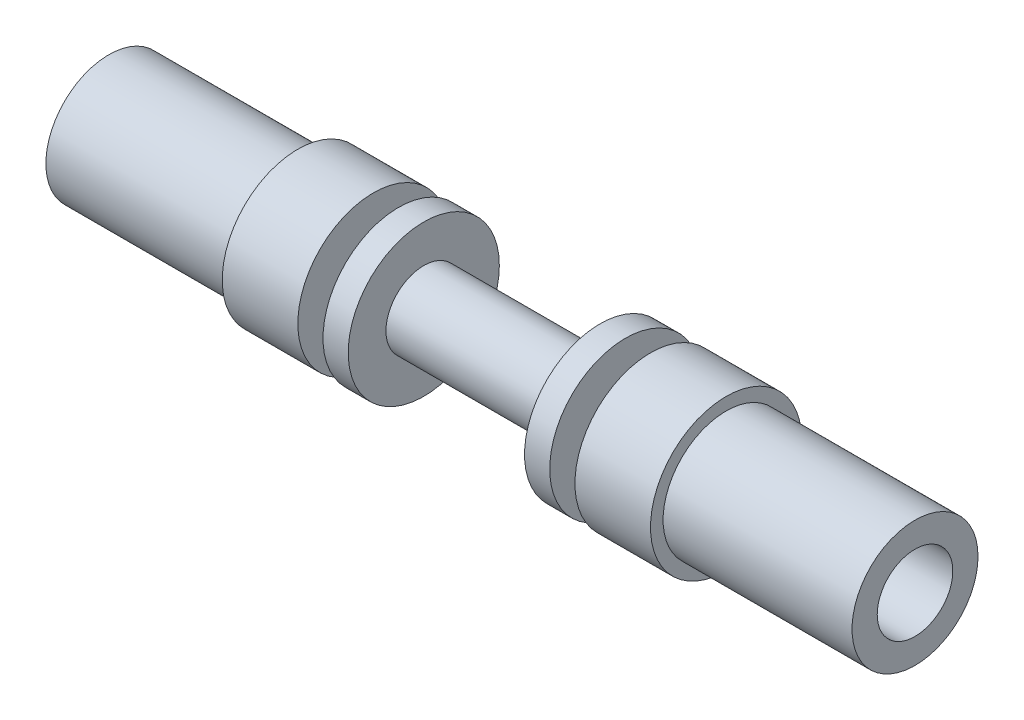
ISO-10303-21;
HEADER;
FILE_DESCRIPTION(('STEP AP214'),'2;1');
FILE_NAME('part.step','',(''),(''),'','','');
FILE_SCHEMA(('AUTOMOTIVE_DESIGN { 1 0 10303 214 1 1 1 1 }'));
ENDSEC;
DATA;
#1=APPLICATION_CONTEXT('core data for automotive mechanical design processes');
#2=APPLICATION_PROTOCOL_DEFINITION('international standard','automotive_design',2000,#1);
#3=PRODUCT_CONTEXT('',#1,'mechanical');
#4=PRODUCT('Part','Part','',(#3));
#5=PRODUCT_RELATED_PRODUCT_CATEGORY('part','',(#4));
#6=PRODUCT_DEFINITION_FORMATION('','',#4);
#7=PRODUCT_DEFINITION_CONTEXT('part definition',#1,'design');
#8=PRODUCT_DEFINITION('design','',#6,#7);
#9=PRODUCT_DEFINITION_SHAPE('','',#8);
#10=(LENGTH_UNIT() NAMED_UNIT(*) SI_UNIT(.MILLI.,.METRE.));
#11=(NAMED_UNIT(*) PLANE_ANGLE_UNIT() SI_UNIT($,.RADIAN.));
#12=(NAMED_UNIT(*) SI_UNIT($,.STERADIAN.) SOLID_ANGLE_UNIT());
#13=UNCERTAINTY_MEASURE_WITH_UNIT(LENGTH_MEASURE(1.E-05),#10,'distance_accuracy_value','');
#14=(GEOMETRIC_REPRESENTATION_CONTEXT(3) GLOBAL_UNCERTAINTY_ASSIGNED_CONTEXT((#13)) GLOBAL_UNIT_ASSIGNED_CONTEXT((#10,
#11,#12)) REPRESENTATION_CONTEXT('',''));
#15=CARTESIAN_POINT('',(0.,0.,0.));
#16=DIRECTION('',(0.,0.,1.));
#17=DIRECTION('',(1.,0.,0.));
#18=AXIS2_PLACEMENT_3D('',#15,#16,#17);
#19=CARTESIAN_POINT('',(-10.,0.,0.));
#20=DIRECTION('',(1.,0.,0.));
#21=DIRECTION('',(0.,0.,-1.));
#22=AXIS2_PLACEMENT_3D('',#19,#20,#21);
#23=PLANE('',#22);
#24=CARTESIAN_POINT('',(-10.,0.,0.));
#25=DIRECTION('',(-1.,0.,0.));
#26=DIRECTION('',(0.,0.,1.));
#27=AXIS2_PLACEMENT_3D('',#24,#25,#26);
#28=CIRCLE('',#27,1.5);
#29=CARTESIAN_POINT('',(-10.,0.,1.5));
#30=VERTEX_POINT('',#29);
#31=EDGE_CURVE('E126',#30,#30,#28,.T.);
#32=ORIENTED_EDGE('',*,*,#31,.T.);
#33=EDGE_LOOP('',(#32));
#34=FACE_BOUND('',#33,.T.);
#35=ADVANCED_FACE('F15',(#34),#23,.F.);
#36=CARTESIAN_POINT('',(-16.,0.,0.));
#37=DIRECTION('',(-1.,0.,0.));
#38=DIRECTION('',(0.,0.,1.));
#39=AXIS2_PLACEMENT_3D('',#36,#37,#38);
#40=CYLINDRICAL_SURFACE('',#39,1.5);
#41=CARTESIAN_POINT('',(-16.,0.,0.));
#42=DIRECTION('',(-1.,0.,0.));
#43=DIRECTION('',(0.,0.,1.));
#44=AXIS2_PLACEMENT_3D('',#41,#42,#43);
#45=CIRCLE('',#44,1.5);
#46=CARTESIAN_POINT('',(-16.,0.,1.5));
#47=VERTEX_POINT('',#46);
#48=EDGE_CURVE('E121',#47,#47,#45,.T.);
#49=ORIENTED_EDGE('',*,*,#48,.T.);
#50=EDGE_LOOP('',(#49));
#51=FACE_BOUND('',#50,.T.);
#52=ORIENTED_EDGE('',*,*,#31,.F.);
#53=EDGE_LOOP('',(#52));
#54=FACE_BOUND('',#53,.T.);
#55=ADVANCED_FACE('F132',(#51,#54),#40,.F.);
#56=CARTESIAN_POINT('',(-16.,0.,0.));
#57=DIRECTION('',(1.,0.,0.));
#58=DIRECTION('',(0.,0.,-1.));
#59=AXIS2_PLACEMENT_3D('',#56,#57,#58);
#60=PLANE('',#59);
#61=ORIENTED_EDGE('',*,*,#48,.F.);
#62=EDGE_LOOP('',(#61));
#63=FACE_BOUND('',#62,.T.);
#64=CARTESIAN_POINT('',(-16.,0.,0.));
#65=DIRECTION('',(1.,0.,0.));
#66=DIRECTION('',(0.,0.,-1.));
#67=AXIS2_PLACEMENT_3D('',#64,#65,#66);
#68=CIRCLE('',#67,2.5);
#69=CARTESIAN_POINT('',(-16.,0.,-2.5));
#70=VERTEX_POINT('',#69);
#71=EDGE_CURVE('E116',#70,#70,#68,.T.);
#72=ORIENTED_EDGE('',*,*,#71,.F.);
#73=EDGE_LOOP('',(#72));
#74=FACE_BOUND('',#73,.T.);
#75=ADVANCED_FACE('F134',(#63,#74),#60,.F.);
#76=CARTESIAN_POINT('',(-16.,0.,0.));
#77=DIRECTION('',(1.,0.,0.));
#78=DIRECTION('',(0.,0.,-1.));
#79=AXIS2_PLACEMENT_3D('',#76,#77,#78);
#80=CYLINDRICAL_SURFACE('',#79,2.5);
#81=ORIENTED_EDGE('',*,*,#71,.T.);
#82=EDGE_LOOP('',(#81));
#83=FACE_BOUND('',#82,.T.);
#84=CARTESIAN_POINT('',(-8.5,0.,0.));
#85=DIRECTION('',(1.,0.,0.));
#86=DIRECTION('',(0.,0.,-1.));
#87=AXIS2_PLACEMENT_3D('',#84,#85,#86);
#88=CIRCLE('',#87,2.5);
#89=CARTESIAN_POINT('',(-8.5,0.,-2.5));
#90=VERTEX_POINT('',#89);
#91=EDGE_CURVE('E111',#90,#90,#88,.F.);
#92=ORIENTED_EDGE('',*,*,#91,.T.);
#93=EDGE_LOOP('',(#92));
#94=FACE_BOUND('',#93,.T.);
#95=ADVANCED_FACE('F141',(#83,#94),#80,.T.);
#96=CARTESIAN_POINT('',(-8.5,0.,0.));
#97=DIRECTION('',(1.,0.,0.));
#98=DIRECTION('',(0.,0.,-1.));
#99=AXIS2_PLACEMENT_3D('',#96,#97,#98);
#100=PLANE('',#99);
#101=ORIENTED_EDGE('',*,*,#91,.F.);
#102=EDGE_LOOP('',(#101));
#103=FACE_BOUND('',#102,.T.);
#104=CARTESIAN_POINT('',(-8.5,0.,0.));
#105=DIRECTION('',(1.,0.,0.));
#106=DIRECTION('',(0.,0.,-1.));
#107=AXIS2_PLACEMENT_3D('',#104,#105,#106);
#108=CIRCLE('',#107,3.);
#109=CARTESIAN_POINT('',(-8.5,0.,-3.));
#110=VERTEX_POINT('',#109);
#111=EDGE_CURVE('E106',#110,#110,#108,.T.);
#112=ORIENTED_EDGE('',*,*,#111,.F.);
#113=EDGE_LOOP('',(#112));
#114=FACE_BOUND('',#113,.T.);
#115=ADVANCED_FACE('F218',(#103,#114),#100,.F.);
#116=CARTESIAN_POINT('',(-8.5,0.,0.));
#117=DIRECTION('',(1.,0.,0.));
#118=DIRECTION('',(0.,0.,-1.));
#119=AXIS2_PLACEMENT_3D('',#116,#117,#118);
#120=CYLINDRICAL_SURFACE('',#119,3.);
#121=ORIENTED_EDGE('',*,*,#111,.T.);
#122=EDGE_LOOP('',(#121));
#123=FACE_BOUND('',#122,.T.);
#124=CARTESIAN_POINT('',(-5.5,0.,0.));
#125=DIRECTION('',(1.,0.,0.));
#126=DIRECTION('',(0.,0.,-1.));
#127=AXIS2_PLACEMENT_3D('',#124,#125,#126);
#128=CIRCLE('',#127,3.);
#129=CARTESIAN_POINT('',(-5.5,0.,-3.));
#130=VERTEX_POINT('',#129);
#131=EDGE_CURVE('E101',#130,#130,#128,.T.);
#132=ORIENTED_EDGE('',*,*,#131,.F.);
#133=EDGE_LOOP('',(#132));
#134=FACE_BOUND('',#133,.T.);
#135=ADVANCED_FACE('F214',(#123,#134),#120,.T.);
#136=CARTESIAN_POINT('',(-5.5,0.,0.));
#137=DIRECTION('',(1.,0.,0.));
#138=DIRECTION('',(0.,0.,-1.));
#139=AXIS2_PLACEMENT_3D('',#136,#137,#138);
#140=PLANE('',#139);
#141=CARTESIAN_POINT('',(-5.5,0.,0.));
#142=DIRECTION('',(-1.,0.,0.));
#143=DIRECTION('',(0.,0.,1.));
#144=AXIS2_PLACEMENT_3D('',#141,#142,#143);
#145=CIRCLE('',#144,1.5);
#146=CARTESIAN_POINT('',(-5.5,0.,1.5));
#147=VERTEX_POINT('',#146);
#148=EDGE_CURVE('E96',#147,#147,#145,.F.);
#149=ORIENTED_EDGE('',*,*,#148,.F.);
#150=EDGE_LOOP('',(#149));
#151=FACE_BOUND('',#150,.T.);
#152=ORIENTED_EDGE('',*,*,#131,.T.);
#153=EDGE_LOOP('',(#152));
#154=FACE_BOUND('',#153,.T.);
#155=ADVANCED_FACE('F210',(#151,#154),#140,.T.);
#156=CARTESIAN_POINT('',(-5.5,0.,0.));
#157=DIRECTION('',(-1.,0.,0.));
#158=DIRECTION('',(0.,0.,1.));
#159=AXIS2_PLACEMENT_3D('',#156,#157,#158);
#160=CYLINDRICAL_SURFACE('',#159,1.5);
#161=ORIENTED_EDGE('',*,*,#148,.T.);
#162=EDGE_LOOP('',(#161));
#163=FACE_BOUND('',#162,.T.);
#164=CARTESIAN_POINT('',(-4.5,0.,0.));
#165=DIRECTION('',(-1.,0.,0.));
#166=DIRECTION('',(0.,0.,1.));
#167=AXIS2_PLACEMENT_3D('',#164,#165,#166);
#168=CIRCLE('',#167,1.5);
#169=CARTESIAN_POINT('',(-4.5,0.,1.5));
#170=VERTEX_POINT('',#169);
#171=EDGE_CURVE('E91',#170,#170,#168,.T.);
#172=ORIENTED_EDGE('',*,*,#171,.T.);
#173=EDGE_LOOP('',(#172));
#174=FACE_BOUND('',#173,.T.);
#175=ADVANCED_FACE('F206',(#163,#174),#160,.T.);
#176=CARTESIAN_POINT('',(-4.5,0.,0.));
#177=DIRECTION('',(1.,0.,0.));
#178=DIRECTION('',(0.,0.,-1.));
#179=AXIS2_PLACEMENT_3D('',#176,#177,#178);
#180=PLANE('',#179);
#181=ORIENTED_EDGE('',*,*,#171,.F.);
#182=EDGE_LOOP('',(#181));
#183=FACE_BOUND('',#182,.T.);
#184=CARTESIAN_POINT('',(-4.5,0.,0.));
#185=DIRECTION('',(1.,0.,0.));
#186=DIRECTION('',(0.,0.,-1.));
#187=AXIS2_PLACEMENT_3D('',#184,#185,#186);
#188=CIRCLE('',#187,3.);
#189=CARTESIAN_POINT('',(-4.5,0.,-3.));
#190=VERTEX_POINT('',#189);
#191=EDGE_CURVE('E86',#190,#190,#188,.T.);
#192=ORIENTED_EDGE('',*,*,#191,.F.);
#193=EDGE_LOOP('',(#192));
#194=FACE_BOUND('',#193,.T.);
#195=ADVANCED_FACE('F202',(#183,#194),#180,.F.);
#196=CARTESIAN_POINT('',(-4.5,0.,0.));
#197=DIRECTION('',(1.,0.,0.));
#198=DIRECTION('',(0.,0.,-1.));
#199=AXIS2_PLACEMENT_3D('',#196,#197,#198);
#200=CYLINDRICAL_SURFACE('',#199,3.);
#201=ORIENTED_EDGE('',*,*,#191,.T.);
#202=EDGE_LOOP('',(#201));
#203=FACE_BOUND('',#202,.T.);
#204=CARTESIAN_POINT('',(-3.5,0.,0.));
#205=DIRECTION('',(1.,0.,0.));
#206=DIRECTION('',(0.,0.,-1.));
#207=AXIS2_PLACEMENT_3D('',#204,#205,#206);
#208=CIRCLE('',#207,3.);
#209=CARTESIAN_POINT('',(-3.5,0.,-3.));
#210=VERTEX_POINT('',#209);
#211=EDGE_CURVE('E81',#210,#210,#208,.T.);
#212=ORIENTED_EDGE('',*,*,#211,.F.);
#213=EDGE_LOOP('',(#212));
#214=FACE_BOUND('',#213,.T.);
#215=ADVANCED_FACE('F198',(#203,#214),#200,.T.);
#216=CARTESIAN_POINT('',(-3.5,0.,0.));
#217=DIRECTION('',(1.,0.,0.));
#218=DIRECTION('',(0.,0.,-1.));
#219=AXIS2_PLACEMENT_3D('',#216,#217,#218);
#220=PLANE('',#219);
#221=CARTESIAN_POINT('',(-3.5,0.,0.));
#222=DIRECTION('',(-1.,0.,0.));
#223=DIRECTION('',(0.,0.,1.));
#224=AXIS2_PLACEMENT_3D('',#221,#222,#223);
#225=CIRCLE('',#224,1.5);
#226=CARTESIAN_POINT('',(-3.5,0.,1.5));
#227=VERTEX_POINT('',#226);
#228=EDGE_CURVE('E76',#227,#227,#225,.F.);
#229=ORIENTED_EDGE('',*,*,#228,.F.);
#230=EDGE_LOOP('',(#229));
#231=FACE_BOUND('',#230,.T.);
#232=ORIENTED_EDGE('',*,*,#211,.T.);
#233=EDGE_LOOP('',(#232));
#234=FACE_BOUND('',#233,.T.);
#235=ADVANCED_FACE('F194',(#231,#234),#220,.T.);
#236=CARTESIAN_POINT('',(-3.5,0.,0.));
#237=DIRECTION('',(-1.,0.,0.));
#238=DIRECTION('',(0.,0.,1.));
#239=AXIS2_PLACEMENT_3D('',#236,#237,#238);
#240=CYLINDRICAL_SURFACE('',#239,1.5);
#241=ORIENTED_EDGE('',*,*,#228,.T.);
#242=EDGE_LOOP('',(#241));
#243=FACE_BOUND('',#242,.T.);
#244=CARTESIAN_POINT('',(3.5,0.,0.));
#245=DIRECTION('',(-1.,0.,0.));
#246=DIRECTION('',(0.,0.,1.));
#247=AXIS2_PLACEMENT_3D('',#244,#245,#246);
#248=CIRCLE('',#247,1.5);
#249=CARTESIAN_POINT('',(3.5,0.,1.5));
#250=VERTEX_POINT('',#249);
#251=EDGE_CURVE('E71',#250,#250,#248,.T.);
#252=ORIENTED_EDGE('',*,*,#251,.T.);
#253=EDGE_LOOP('',(#252));
#254=FACE_BOUND('',#253,.T.);
#255=ADVANCED_FACE('F190',(#243,#254),#240,.T.);
#256=CARTESIAN_POINT('',(3.5,0.,0.));
#257=DIRECTION('',(1.,0.,0.));
#258=DIRECTION('',(0.,0.,-1.));
#259=AXIS2_PLACEMENT_3D('',#256,#257,#258);
#260=PLANE('',#259);
#261=ORIENTED_EDGE('',*,*,#251,.F.);
#262=EDGE_LOOP('',(#261));
#263=FACE_BOUND('',#262,.T.);
#264=CARTESIAN_POINT('',(3.5,0.,0.));
#265=DIRECTION('',(1.,0.,0.));
#266=DIRECTION('',(0.,0.,-1.));
#267=AXIS2_PLACEMENT_3D('',#264,#265,#266);
#268=CIRCLE('',#267,3.);
#269=CARTESIAN_POINT('',(3.5,0.,-3.));
#270=VERTEX_POINT('',#269);
#271=EDGE_CURVE('E66',#270,#270,#268,.T.);
#272=ORIENTED_EDGE('',*,*,#271,.F.);
#273=EDGE_LOOP('',(#272));
#274=FACE_BOUND('',#273,.T.);
#275=ADVANCED_FACE('F186',(#263,#274),#260,.F.);
#276=CARTESIAN_POINT('',(-4.5,0.,0.));
#277=DIRECTION('',(1.,0.,0.));
#278=DIRECTION('',(0.,0.,-1.));
#279=AXIS2_PLACEMENT_3D('',#276,#277,#278);
#280=CYLINDRICAL_SURFACE('',#279,3.);
#281=ORIENTED_EDGE('',*,*,#271,.T.);
#282=EDGE_LOOP('',(#281));
#283=FACE_BOUND('',#282,.T.);
#284=CARTESIAN_POINT('',(4.5,0.,0.));
#285=DIRECTION('',(1.,0.,0.));
#286=DIRECTION('',(0.,0.,-1.));
#287=AXIS2_PLACEMENT_3D('',#284,#285,#286);
#288=CIRCLE('',#287,3.);
#289=CARTESIAN_POINT('',(4.5,0.,-3.));
#290=VERTEX_POINT('',#289);
#291=EDGE_CURVE('E61',#290,#290,#288,.T.);
#292=ORIENTED_EDGE('',*,*,#291,.F.);
#293=EDGE_LOOP('',(#292));
#294=FACE_BOUND('',#293,.T.);
#295=ADVANCED_FACE('F182',(#283,#294),#280,.T.);
#296=CARTESIAN_POINT('',(4.5,0.,0.));
#297=DIRECTION('',(1.,0.,0.));
#298=DIRECTION('',(0.,0.,-1.));
#299=AXIS2_PLACEMENT_3D('',#296,#297,#298);
#300=PLANE('',#299);
#301=CARTESIAN_POINT('',(4.5,0.,0.));
#302=DIRECTION('',(-1.,0.,0.));
#303=DIRECTION('',(0.,0.,1.));
#304=AXIS2_PLACEMENT_3D('',#301,#302,#303);
#305=CIRCLE('',#304,1.5);
#306=CARTESIAN_POINT('',(4.5,0.,1.5));
#307=VERTEX_POINT('',#306);
#308=EDGE_CURVE('E56',#307,#307,#305,.F.);
#309=ORIENTED_EDGE('',*,*,#308,.F.);
#310=EDGE_LOOP('',(#309));
#311=FACE_BOUND('',#310,.T.);
#312=ORIENTED_EDGE('',*,*,#291,.T.);
#313=EDGE_LOOP('',(#312));
#314=FACE_BOUND('',#313,.T.);
#315=ADVANCED_FACE('F178',(#311,#314),#300,.T.);
#316=CARTESIAN_POINT('',(-5.5,0.,0.));
#317=DIRECTION('',(-1.,0.,0.));
#318=DIRECTION('',(0.,0.,1.));
#319=AXIS2_PLACEMENT_3D('',#316,#317,#318);
#320=CYLINDRICAL_SURFACE('',#319,1.5);
#321=ORIENTED_EDGE('',*,*,#308,.T.);
#322=EDGE_LOOP('',(#321));
#323=FACE_BOUND('',#322,.T.);
#324=CARTESIAN_POINT('',(5.5,0.,0.));
#325=DIRECTION('',(-1.,0.,0.));
#326=DIRECTION('',(0.,0.,1.));
#327=AXIS2_PLACEMENT_3D('',#324,#325,#326);
#328=CIRCLE('',#327,1.5);
#329=CARTESIAN_POINT('',(5.5,0.,1.5));
#330=VERTEX_POINT('',#329);
#331=EDGE_CURVE('E51',#330,#330,#328,.T.);
#332=ORIENTED_EDGE('',*,*,#331,.T.);
#333=EDGE_LOOP('',(#332));
#334=FACE_BOUND('',#333,.T.);
#335=ADVANCED_FACE('F174',(#323,#334),#320,.T.);
#336=CARTESIAN_POINT('',(10.,0.,0.));
#337=DIRECTION('',(1.,0.,0.));
#338=DIRECTION('',(0.,0.,-1.));
#339=AXIS2_PLACEMENT_3D('',#336,#337,#338);
#340=PLANE('',#339);
#341=CARTESIAN_POINT('',(10.,0.,0.));
#342=DIRECTION('',(-1.,0.,0.));
#343=DIRECTION('',(0.,0.,1.));
#344=AXIS2_PLACEMENT_3D('',#341,#342,#343);
#345=CIRCLE('',#344,1.5);
#346=CARTESIAN_POINT('',(10.,0.,1.5));
#347=VERTEX_POINT('',#346);
#348=EDGE_CURVE('E46',#347,#347,#345,.F.);
#349=ORIENTED_EDGE('',*,*,#348,.T.);
#350=EDGE_LOOP('',(#349));
#351=FACE_BOUND('',#350,.T.);
#352=ADVANCED_FACE('F170',(#351),#340,.T.);
#353=CARTESIAN_POINT('',(5.5,0.,0.));
#354=DIRECTION('',(1.,0.,0.));
#355=DIRECTION('',(0.,0.,-1.));
#356=AXIS2_PLACEMENT_3D('',#353,#354,#355);
#357=PLANE('',#356);
#358=ORIENTED_EDGE('',*,*,#331,.F.);
#359=EDGE_LOOP('',(#358));
#360=FACE_BOUND('',#359,.T.);
#361=CARTESIAN_POINT('',(5.5,0.,0.));
#362=DIRECTION('',(1.,0.,0.));
#363=DIRECTION('',(0.,0.,-1.));
#364=AXIS2_PLACEMENT_3D('',#361,#362,#363);
#365=CIRCLE('',#364,3.);
#366=CARTESIAN_POINT('',(5.5,0.,-3.));
#367=VERTEX_POINT('',#366);
#368=EDGE_CURVE('E41',#367,#367,#365,.T.);
#369=ORIENTED_EDGE('',*,*,#368,.F.);
#370=EDGE_LOOP('',(#369));
#371=FACE_BOUND('',#370,.T.);
#372=ADVANCED_FACE('F166',(#360,#371),#357,.F.);
#373=CARTESIAN_POINT('',(-16.,0.,0.));
#374=DIRECTION('',(-1.,0.,0.));
#375=DIRECTION('',(0.,0.,1.));
#376=AXIS2_PLACEMENT_3D('',#373,#374,#375);
#377=CYLINDRICAL_SURFACE('',#376,1.5);
#378=ORIENTED_EDGE('',*,*,#348,.F.);
#379=EDGE_LOOP('',(#378));
#380=FACE_BOUND('',#379,.T.);
#381=CARTESIAN_POINT('',(16.,0.,0.));
#382=DIRECTION('',(-1.,0.,0.));
#383=DIRECTION('',(0.,0.,1.));
#384=AXIS2_PLACEMENT_3D('',#381,#382,#383);
#385=CIRCLE('',#384,1.5);
#386=CARTESIAN_POINT('',(16.,0.,1.5));
#387=VERTEX_POINT('',#386);
#388=EDGE_CURVE('E36',#387,#387,#385,.T.);
#389=ORIENTED_EDGE('',*,*,#388,.F.);
#390=EDGE_LOOP('',(#389));
#391=FACE_BOUND('',#390,.T.);
#392=ADVANCED_FACE('F162',(#380,#391),#377,.F.);
#393=CARTESIAN_POINT('',(-8.5,0.,0.));
#394=DIRECTION('',(1.,0.,0.));
#395=DIRECTION('',(0.,0.,-1.));
#396=AXIS2_PLACEMENT_3D('',#393,#394,#395);
#397=CYLINDRICAL_SURFACE('',#396,3.);
#398=ORIENTED_EDGE('',*,*,#368,.T.);
#399=EDGE_LOOP('',(#398));
#400=FACE_BOUND('',#399,.T.);
#401=CARTESIAN_POINT('',(8.5,0.,0.));
#402=DIRECTION('',(1.,0.,0.));
#403=DIRECTION('',(0.,0.,-1.));
#404=AXIS2_PLACEMENT_3D('',#401,#402,#403);
#405=CIRCLE('',#404,3.);
#406=CARTESIAN_POINT('',(8.5,0.,-3.));
#407=VERTEX_POINT('',#406);
#408=EDGE_CURVE('E27',#407,#407,#405,.T.);
#409=ORIENTED_EDGE('',*,*,#408,.F.);
#410=EDGE_LOOP('',(#409));
#411=FACE_BOUND('',#410,.T.);
#412=ADVANCED_FACE('F158',(#400,#411),#397,.T.);
#413=CARTESIAN_POINT('',(16.,0.,0.));
#414=DIRECTION('',(1.,0.,0.));
#415=DIRECTION('',(0.,0.,-1.));
#416=AXIS2_PLACEMENT_3D('',#413,#414,#415);
#417=PLANE('',#416);
#418=ORIENTED_EDGE('',*,*,#388,.T.);
#419=EDGE_LOOP('',(#418));
#420=FACE_BOUND('',#419,.T.);
#421=CARTESIAN_POINT('',(16.,0.,0.));
#422=DIRECTION('',(1.,0.,0.));
#423=DIRECTION('',(0.,0.,-1.));
#424=AXIS2_PLACEMENT_3D('',#421,#422,#423);
#425=CIRCLE('',#424,2.5);
#426=CARTESIAN_POINT('',(16.,0.,-2.5));
#427=VERTEX_POINT('',#426);
#428=EDGE_CURVE('E22',#427,#427,#425,.F.);
#429=ORIENTED_EDGE('',*,*,#428,.F.);
#430=EDGE_LOOP('',(#429));
#431=FACE_BOUND('',#430,.T.);
#432=ADVANCED_FACE('F151',(#420,#431),#417,.T.);
#433=CARTESIAN_POINT('',(8.5,0.,0.));
#434=DIRECTION('',(1.,0.,0.));
#435=DIRECTION('',(0.,0.,-1.));
#436=AXIS2_PLACEMENT_3D('',#433,#434,#435);
#437=PLANE('',#436);
#438=CARTESIAN_POINT('',(8.5,0.,0.));
#439=DIRECTION('',(1.,0.,0.));
#440=DIRECTION('',(0.,0.,-1.));
#441=AXIS2_PLACEMENT_3D('',#438,#439,#440);
#442=CIRCLE('',#441,2.5);
#443=CARTESIAN_POINT('',(8.5,0.,-2.5));
#444=VERTEX_POINT('',#443);
#445=EDGE_CURVE('E10',#444,#444,#442,.T.);
#446=ORIENTED_EDGE('',*,*,#445,.F.);
#447=EDGE_LOOP('',(#446));
#448=FACE_BOUND('',#447,.T.);
#449=ORIENTED_EDGE('',*,*,#408,.T.);
#450=EDGE_LOOP('',(#449));
#451=FACE_BOUND('',#450,.T.);
#452=ADVANCED_FACE('F146',(#448,#451),#437,.T.);
#453=CARTESIAN_POINT('',(-16.,0.,0.));
#454=DIRECTION('',(1.,0.,0.));
#455=DIRECTION('',(0.,0.,-1.));
#456=AXIS2_PLACEMENT_3D('',#453,#454,#455);
#457=CYLINDRICAL_SURFACE('',#456,2.5);
#458=ORIENTED_EDGE('',*,*,#445,.T.);
#459=EDGE_LOOP('',(#458));
#460=FACE_BOUND('',#459,.T.);
#461=ORIENTED_EDGE('',*,*,#428,.T.);
#462=EDGE_LOOP('',(#461));
#463=FACE_BOUND('',#462,.T.);
#464=ADVANCED_FACE('F144',(#460,#463),#457,.T.);
#465=CLOSED_SHELL('',(#35,#55,#75,#95,#115,#135,#155,#175,#195,#215,#235,#255,#275,#295,#315,
#335,#352,#372,#392,#412,#432,#452,#464));
#466=MANIFOLD_SOLID_BREP('B1',#465);
#467=ADVANCED_BREP_SHAPE_REPRESENTATION('',(#18,#466),#14);
#468=SHAPE_DEFINITION_REPRESENTATION(#9,#467);
ENDSEC;
END-ISO-10303-21;
